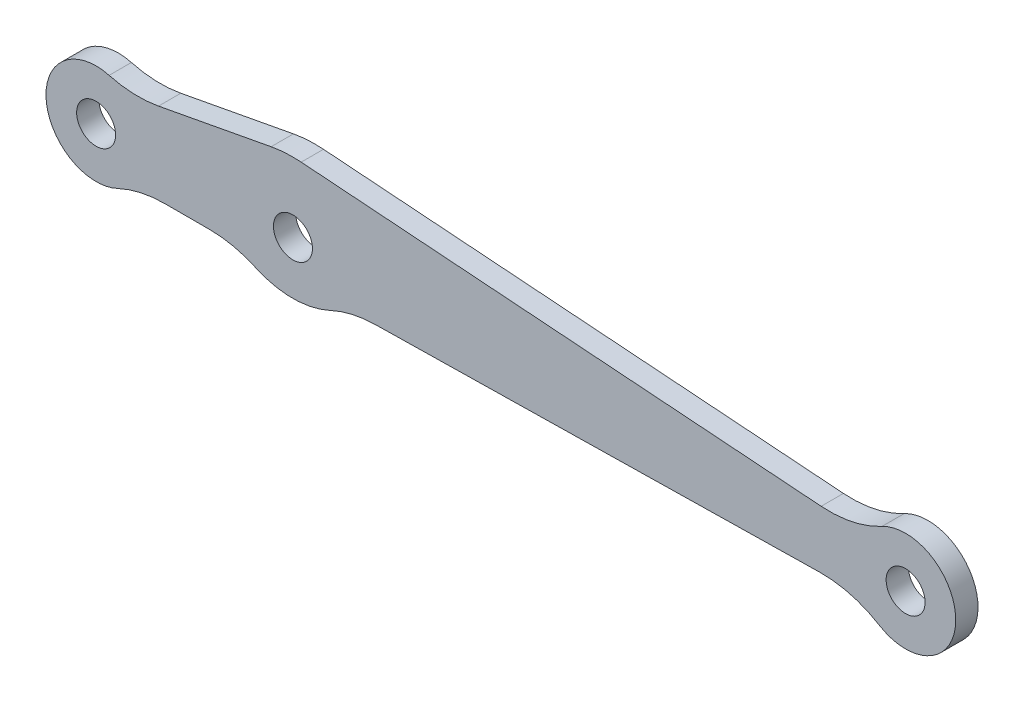
ISO-10303-21;
HEADER;
FILE_DESCRIPTION(('STEP AP214'),'2;1');
FILE_NAME('part.step','',(''),(''),'','','');
FILE_SCHEMA(('AUTOMOTIVE_DESIGN { 1 0 10303 214 1 1 1 1 }'));
ENDSEC;
DATA;
#1=APPLICATION_CONTEXT('core data for automotive mechanical design processes');
#2=APPLICATION_PROTOCOL_DEFINITION('international standard','automotive_design',2000,#1);
#3=PRODUCT_CONTEXT('',#1,'mechanical');
#4=PRODUCT('Part','Part','',(#3));
#5=PRODUCT_RELATED_PRODUCT_CATEGORY('part','',(#4));
#6=PRODUCT_DEFINITION_FORMATION('','',#4);
#7=PRODUCT_DEFINITION_CONTEXT('part definition',#1,'design');
#8=PRODUCT_DEFINITION('design','',#6,#7);
#9=PRODUCT_DEFINITION_SHAPE('','',#8);
#10=(LENGTH_UNIT() NAMED_UNIT(*) SI_UNIT(.MILLI.,.METRE.));
#11=(NAMED_UNIT(*) PLANE_ANGLE_UNIT() SI_UNIT($,.RADIAN.));
#12=(NAMED_UNIT(*) SI_UNIT($,.STERADIAN.) SOLID_ANGLE_UNIT());
#13=UNCERTAINTY_MEASURE_WITH_UNIT(LENGTH_MEASURE(1.E-05),#10,'distance_accuracy_value','');
#14=(GEOMETRIC_REPRESENTATION_CONTEXT(3) GLOBAL_UNCERTAINTY_ASSIGNED_CONTEXT((#13)) GLOBAL_UNIT_ASSIGNED_CONTEXT((#10,
#11,#12)) REPRESENTATION_CONTEXT('',''));
#15=CARTESIAN_POINT('',(0.,0.,0.));
#16=DIRECTION('',(0.,0.,1.));
#17=DIRECTION('',(1.,0.,0.));
#18=AXIS2_PLACEMENT_3D('',#15,#16,#17);
#19=CARTESIAN_POINT('',(48.1470908733665,12.7784050844424,2.));
#20=DIRECTION('',(0.,0.,-1.));
#21=DIRECTION('',(-1.,0.,0.));
#22=AXIS2_PLACEMENT_3D('',#19,#20,#21);
#23=PLANE('',#22);
#24=CARTESIAN_POINT('',(48.1470908733665,12.7784050844424,2.));
#25=DIRECTION('',(0.,0.,-1.));
#26=DIRECTION('',(-1.,0.,0.));
#27=AXIS2_PLACEMENT_3D('',#24,#25,#26);
#28=CIRCLE('',#27,9.99999999999999);
#29=CARTESIAN_POINT('',(52.873235098631,3.96571192275799,2.));
#30=VERTEX_POINT('',#29);
#31=CARTESIAN_POINT('',(47.4170222580364,2.8050906997,2.));
#32=VERTEX_POINT('',#31);
#33=EDGE_CURVE('E195',#30,#32,#28,.T.);
#34=ORIENTED_EDGE('',*,*,#33,.T.);
#35=DIRECTION('',(-0.997331438474241,0.0730068615330152,0.));
#36=VECTOR('',#35,1.);
#37=CARTESIAN_POINT('',(47.4170222580364,2.8050906997,2.));
#38=LINE('',#37,#36);
#39=CARTESIAN_POINT('',(0.741973806082332,6.22180721732193,2.));
#40=VERTEX_POINT('',#39);
#41=EDGE_CURVE('E113',#32,#40,#38,.T.);
#42=ORIENTED_EDGE('',*,*,#41,.T.);
#43=CARTESIAN_POINT('',(-0.0245982400143271,-4.2501728866576,2.));
#44=DIRECTION('',(0.,0.,1.));
#45=DIRECTION('',(-1.,0.,0.));
#46=AXIS2_PLACEMENT_3D('',#43,#44,#45);
#47=CIRCLE('',#46,10.5);
#48=CARTESIAN_POINT('',(-1.95917748938479,6.0700695101035,2.));
#49=VERTEX_POINT('',#48);
#50=EDGE_CURVE('E228',#40,#49,#47,.T.);
#51=ORIENTED_EDGE('',*,*,#50,.T.);
#52=DIRECTION('',(-0.982880228262961,-0.184245642797188,0.));
#53=VECTOR('',#52,1.);
#54=CARTESIAN_POINT('',(-1.95917748938479,6.0700695101035,2.));
#55=LINE('',#54,#53);
#56=CARTESIAN_POINT('',(-12.0675349542623,4.17520911390696,2.));
#57=VERTEX_POINT('',#56);
#58=EDGE_CURVE('E247',#49,#57,#55,.T.);
#59=ORIENTED_EDGE('',*,*,#58,.T.);
#60=CARTESIAN_POINT('',(-13.9099913822341,14.0040113965366,2.));
#61=DIRECTION('',(0.,0.,-1.));
#62=DIRECTION('',(-1.,0.,0.));
#63=AXIS2_PLACEMENT_3D('',#60,#61,#62);
#64=CIRCLE('',#63,10.);
#65=CARTESIAN_POINT('',(-16.5031007737968,4.34607250237342,2.));
#66=VERTEX_POINT('',#65);
#67=EDGE_CURVE('E244',#57,#66,#64,.T.);
#68=ORIENTED_EDGE('',*,*,#67,.T.);
#69=CARTESIAN_POINT('',(-17.67,0.,2.));
#70=DIRECTION('',(0.,0.,1.));
#71=DIRECTION('',(1.,0.,0.));
#72=AXIS2_PLACEMENT_3D('',#69,#70,#71);
#73=CIRCLE('',#72,4.5);
#74=CARTESIAN_POINT('',(-15.7572993565416,-4.07327586206896,2.));
#75=VERTEX_POINT('',#74);
#76=EDGE_CURVE('E246',#66,#75,#73,.T.);
#77=ORIENTED_EDGE('',*,*,#76,.T.);
#78=CARTESIAN_POINT('',(-11.5068534821895,-13.125,2.));
#79=DIRECTION('',(0.,0.,-1.));
#80=DIRECTION('',(-1.,0.,0.));
#81=AXIS2_PLACEMENT_3D('',#78,#79,#80);
#82=CIRCLE('',#81,9.99999999999999);
#83=CARTESIAN_POINT('',(-11.5068534821895,-3.125,2.));
#84=VERTEX_POINT('',#83);
#85=EDGE_CURVE('E249',#75,#84,#82,.T.);
#86=ORIENTED_EDGE('',*,*,#85,.T.);
#87=DIRECTION('',(1.,0.,0.));
#88=VECTOR('',#87,1.);
#89=CARTESIAN_POINT('',(-7.49859405959702,-3.125,2.));
#90=LINE('',#89,#88);
#91=CARTESIAN_POINT('',(-7.49859405959702,-3.12499999999998,2.));
#92=VERTEX_POINT('',#91);
#93=EDGE_CURVE('E255',#84,#92,#90,.T.);
#94=ORIENTED_EDGE('',*,*,#93,.T.);
#95=CARTESIAN_POINT('',(-7.49859405959702,-13.125,2.));
#96=DIRECTION('',(0.,0.,-1.));
#97=DIRECTION('',(1.,0.,0.));
#98=AXIS2_PLACEMENT_3D('',#95,#96,#97);
#99=CIRCLE('',#98,10.);
#100=CARTESIAN_POINT('',(-3.34637415982887,-4.02779878732091,2.));
#101=VERTEX_POINT('',#100);
#102=EDGE_CURVE('E257',#92,#101,#99,.T.);
#103=ORIENTED_EDGE('',*,*,#102,.T.);
#104=CARTESIAN_POINT('',(-0.0245982400143267,3.24996218282238,2.));
#105=DIRECTION('',(0.,0.,1.));
#106=DIRECTION('',(1.,0.,0.));
#107=AXIS2_PLACEMENT_3D('',#104,#105,#106);
#108=CIRCLE('',#107,8.00000000000004);
#109=CARTESIAN_POINT('',(3.3418696860677,-4.00723381168279,2.));
#110=VERTEX_POINT('',#109);
#111=EDGE_CURVE('E259',#101,#110,#108,.T.);
#112=ORIENTED_EDGE('',*,*,#111,.T.);
#113=CARTESIAN_POINT('',(7.5499545936702,-13.0787288048142,2.));
#114=DIRECTION('',(0.,0.,-1.));
#115=DIRECTION('',(-1.,0.,0.));
#116=AXIS2_PLACEMENT_3D('',#113,#114,#115);
#117=CIRCLE('',#116,10.);
#118=CARTESIAN_POINT('',(7.37564840586103,-3.08024805257532,2.));
#119=VERTEX_POINT('',#118);
#120=EDGE_CURVE('E150',#110,#119,#117,.T.);
#121=ORIENTED_EDGE('',*,*,#120,.T.);
#122=DIRECTION('',(0.999848075223888,0.0174306187809175,0.));
#123=VECTOR('',#122,1.);
#124=CARTESIAN_POINT('',(7.37564840586103,-3.08024805257532,2.));
#125=LINE('',#124,#123);
#126=CARTESIAN_POINT('',(47.2817916074741,-2.38455359018586,2.));
#127=VERTEX_POINT('',#126);
#128=EDGE_CURVE('E144',#119,#127,#125,.T.);
#129=ORIENTED_EDGE('',*,*,#128,.T.);
#130=CARTESIAN_POINT('',(47.4560977952833,-12.3830343424247,2.));
#131=DIRECTION('',(0.,0.,-1.));
#132=DIRECTION('',(1.,0.,0.));
#133=AXIS2_PLACEMENT_3D('',#130,#131,#132);
#134=CIRCLE('',#133,9.99999999999999);
#135=CARTESIAN_POINT('',(52.65878897095,-3.84301065799389,2.));
#136=VERTEX_POINT('',#135);
#137=EDGE_CURVE('E148',#127,#136,#134,.T.);
#138=ORIENTED_EDGE('',*,*,#137,.T.);
#139=CARTESIAN_POINT('',(55.,0.,2.));
#140=DIRECTION('',(0.,0.,1.));
#141=DIRECTION('',(-1.,0.,0.));
#142=AXIS2_PLACEMENT_3D('',#139,#140,#141);
#143=CIRCLE('',#142,4.5);
#144=EDGE_CURVE('E52',#136,#30,#143,.T.);
#145=ORIENTED_EDGE('',*,*,#144,.T.);
#146=EDGE_LOOP('',(#34,#42,#51,#59,#68,#77,#86,#94,#103,#112,#121,#129,#138,#145));
#147=FACE_BOUND('',#146,.T.);
#148=CARTESIAN_POINT('',(-17.67,0.,2.));
#149=DIRECTION('',(0.,0.,1.));
#150=DIRECTION('',(1.,0.,0.));
#151=AXIS2_PLACEMENT_3D('',#148,#149,#150);
#152=CIRCLE('',#151,1.75);
#153=CARTESIAN_POINT('',(-15.92,0.,2.));
#154=VERTEX_POINT('',#153);
#155=EDGE_CURVE('E172',#154,#154,#152,.T.);
#156=ORIENTED_EDGE('',*,*,#155,.F.);
#157=EDGE_LOOP('',(#156));
#158=FACE_BOUND('',#157,.T.);
#159=CARTESIAN_POINT('',(0.,0.,2.));
#160=DIRECTION('',(0.,0.,1.));
#161=DIRECTION('',(1.,0.,0.));
#162=AXIS2_PLACEMENT_3D('',#159,#160,#161);
#163=CIRCLE('',#162,1.75);
#164=CARTESIAN_POINT('',(1.75,0.,2.));
#165=VERTEX_POINT('',#164);
#166=EDGE_CURVE('E313',#165,#165,#163,.T.);
#167=ORIENTED_EDGE('',*,*,#166,.F.);
#168=EDGE_LOOP('',(#167));
#169=FACE_BOUND('',#168,.T.);
#170=CARTESIAN_POINT('',(55.,0.,2.));
#171=DIRECTION('',(0.,0.,1.));
#172=DIRECTION('',(1.,0.,0.));
#173=AXIS2_PLACEMENT_3D('',#170,#171,#172);
#174=CIRCLE('',#173,1.75);
#175=CARTESIAN_POINT('',(56.75,0.,2.));
#176=VERTEX_POINT('',#175);
#177=EDGE_CURVE('E304',#176,#176,#174,.T.);
#178=ORIENTED_EDGE('',*,*,#177,.F.);
#179=EDGE_LOOP('',(#178));
#180=FACE_BOUND('',#179,.T.);
#181=ADVANCED_FACE('F35',(#147,#158,#169,#180),#23,.F.);
#182=CARTESIAN_POINT('',(48.1470908733665,12.7784050844424,0.));
#183=DIRECTION('',(0.,0.,-1.));
#184=DIRECTION('',(-1.,0.,0.));
#185=AXIS2_PLACEMENT_3D('',#182,#183,#184);
#186=PLANE('',#185);
#187=CARTESIAN_POINT('',(0.,0.,0.));
#188=DIRECTION('',(0.,0.,1.));
#189=DIRECTION('',(1.,0.,0.));
#190=AXIS2_PLACEMENT_3D('',#187,#188,#189);
#191=CIRCLE('',#190,1.75);
#192=CARTESIAN_POINT('',(1.75,0.,0.));
#193=VERTEX_POINT('',#192);
#194=EDGE_CURVE('E310',#193,#193,#191,.T.);
#195=ORIENTED_EDGE('',*,*,#194,.T.);
#196=EDGE_LOOP('',(#195));
#197=FACE_BOUND('',#196,.T.);
#198=CARTESIAN_POINT('',(48.1470908733665,12.7784050844424,0.));
#199=DIRECTION('',(0.,0.,-1.));
#200=DIRECTION('',(-1.,0.,0.));
#201=AXIS2_PLACEMENT_3D('',#198,#199,#200);
#202=CIRCLE('',#201,9.99999999999999);
#203=CARTESIAN_POINT('',(52.873235098631,3.96571192275799,0.));
#204=VERTEX_POINT('',#203);
#205=CARTESIAN_POINT('',(47.4170222580364,2.8050906997,0.));
#206=VERTEX_POINT('',#205);
#207=EDGE_CURVE('E168',#204,#206,#202,.T.);
#208=ORIENTED_EDGE('',*,*,#207,.F.);
#209=CARTESIAN_POINT('',(55.,0.,0.));
#210=DIRECTION('',(0.,0.,1.));
#211=DIRECTION('',(-1.,0.,0.));
#212=AXIS2_PLACEMENT_3D('',#209,#210,#211);
#213=CIRCLE('',#212,4.5);
#214=CARTESIAN_POINT('',(52.65878897095,-3.84301065799389,0.));
#215=VERTEX_POINT('',#214);
#216=EDGE_CURVE('E105',#215,#204,#213,.T.);
#217=ORIENTED_EDGE('',*,*,#216,.F.);
#218=CARTESIAN_POINT('',(47.4560977952833,-12.3830343424247,0.));
#219=DIRECTION('',(0.,0.,-1.));
#220=DIRECTION('',(1.,0.,0.));
#221=AXIS2_PLACEMENT_3D('',#218,#219,#220);
#222=CIRCLE('',#221,9.99999999999999);
#223=CARTESIAN_POINT('',(47.2817916074741,-2.38455359018586,0.));
#224=VERTEX_POINT('',#223);
#225=EDGE_CURVE('E99',#224,#215,#222,.T.);
#226=ORIENTED_EDGE('',*,*,#225,.F.);
#227=DIRECTION('',(0.999848075223888,0.0174306187809175,0.));
#228=VECTOR('',#227,1.);
#229=CARTESIAN_POINT('',(7.37564840586103,-3.08024805257532,0.));
#230=LINE('',#229,#228);
#231=CARTESIAN_POINT('',(7.37564840586103,-3.08024805257532,0.));
#232=VERTEX_POINT('',#231);
#233=EDGE_CURVE('E158',#232,#224,#230,.T.);
#234=ORIENTED_EDGE('',*,*,#233,.F.);
#235=CARTESIAN_POINT('',(7.5499545936702,-13.0787288048142,0.));
#236=DIRECTION('',(0.,0.,-1.));
#237=DIRECTION('',(-1.,0.,0.));
#238=AXIS2_PLACEMENT_3D('',#235,#236,#237);
#239=CIRCLE('',#238,10.);
#240=CARTESIAN_POINT('',(3.3418696860677,-4.00723381168279,0.));
#241=VERTEX_POINT('',#240);
#242=EDGE_CURVE('E190',#241,#232,#239,.T.);
#243=ORIENTED_EDGE('',*,*,#242,.F.);
#244=CARTESIAN_POINT('',(-0.0245982400143267,3.24996218282238,0.));
#245=DIRECTION('',(0.,0.,1.));
#246=DIRECTION('',(1.,0.,0.));
#247=AXIS2_PLACEMENT_3D('',#244,#245,#246);
#248=CIRCLE('',#247,8.00000000000004);
#249=CARTESIAN_POINT('',(-3.34637415982887,-4.02779878732091,0.));
#250=VERTEX_POINT('',#249);
#251=EDGE_CURVE('E188',#250,#241,#248,.T.);
#252=ORIENTED_EDGE('',*,*,#251,.F.);
#253=CARTESIAN_POINT('',(-7.49859405959702,-13.125,0.));
#254=DIRECTION('',(0.,0.,-1.));
#255=DIRECTION('',(1.,0.,0.));
#256=AXIS2_PLACEMENT_3D('',#253,#254,#255);
#257=CIRCLE('',#256,10.);
#258=CARTESIAN_POINT('',(-7.49859405959702,-3.12499999999998,0.));
#259=VERTEX_POINT('',#258);
#260=EDGE_CURVE('E186',#259,#250,#257,.T.);
#261=ORIENTED_EDGE('',*,*,#260,.F.);
#262=DIRECTION('',(1.,0.,0.));
#263=VECTOR('',#262,1.);
#264=CARTESIAN_POINT('',(-7.49859405959702,-3.125,0.));
#265=LINE('',#264,#263);
#266=CARTESIAN_POINT('',(-11.5068534821895,-3.125,0.));
#267=VERTEX_POINT('',#266);
#268=EDGE_CURVE('E184',#267,#259,#265,.T.);
#269=ORIENTED_EDGE('',*,*,#268,.F.);
#270=CARTESIAN_POINT('',(-11.5068534821895,-13.125,0.));
#271=DIRECTION('',(0.,0.,-1.));
#272=DIRECTION('',(-1.,0.,0.));
#273=AXIS2_PLACEMENT_3D('',#270,#271,#272);
#274=CIRCLE('',#273,9.99999999999999);
#275=CARTESIAN_POINT('',(-15.7572993565416,-4.07327586206896,0.));
#276=VERTEX_POINT('',#275);
#277=EDGE_CURVE('E182',#276,#267,#274,.T.);
#278=ORIENTED_EDGE('',*,*,#277,.F.);
#279=CARTESIAN_POINT('',(-17.67,0.,0.));
#280=DIRECTION('',(0.,0.,1.));
#281=DIRECTION('',(1.,0.,0.));
#282=AXIS2_PLACEMENT_3D('',#279,#280,#281);
#283=CIRCLE('',#282,4.5);
#284=CARTESIAN_POINT('',(-16.5031007737968,4.34607250237342,0.));
#285=VERTEX_POINT('',#284);
#286=EDGE_CURVE('E180',#285,#276,#283,.T.);
#287=ORIENTED_EDGE('',*,*,#286,.F.);
#288=CARTESIAN_POINT('',(-13.9099913822341,14.0040113965366,0.));
#289=DIRECTION('',(0.,0.,-1.));
#290=DIRECTION('',(-1.,0.,0.));
#291=AXIS2_PLACEMENT_3D('',#288,#289,#290);
#292=CIRCLE('',#291,10.);
#293=CARTESIAN_POINT('',(-12.0675349542623,4.17520911390696,0.));
#294=VERTEX_POINT('',#293);
#295=EDGE_CURVE('E178',#294,#285,#292,.T.);
#296=ORIENTED_EDGE('',*,*,#295,.F.);
#297=DIRECTION('',(-0.982880228262961,-0.184245642797188,0.));
#298=VECTOR('',#297,1.);
#299=CARTESIAN_POINT('',(-1.95917748938479,6.0700695101035,0.));
#300=LINE('',#299,#298);
#301=CARTESIAN_POINT('',(-1.95917748938479,6.0700695101035,0.));
#302=VERTEX_POINT('',#301);
#303=EDGE_CURVE('E176',#302,#294,#300,.T.);
#304=ORIENTED_EDGE('',*,*,#303,.F.);
#305=CARTESIAN_POINT('',(-0.0245982400143271,-4.2501728866576,0.));
#306=DIRECTION('',(0.,0.,1.));
#307=DIRECTION('',(-1.,0.,0.));
#308=AXIS2_PLACEMENT_3D('',#305,#306,#307);
#309=CIRCLE('',#308,10.5);
#310=CARTESIAN_POINT('',(0.741973806082332,6.22180721732193,0.));
#311=VERTEX_POINT('',#310);
#312=EDGE_CURVE('E174',#311,#302,#309,.T.);
#313=ORIENTED_EDGE('',*,*,#312,.F.);
#314=DIRECTION('',(-0.997331438474241,0.0730068615330152,0.));
#315=VECTOR('',#314,1.);
#316=CARTESIAN_POINT('',(47.4170222580364,2.8050906997,0.));
#317=LINE('',#316,#315);
#318=EDGE_CURVE('E171',#206,#311,#317,.T.);
#319=ORIENTED_EDGE('',*,*,#318,.F.);
#320=EDGE_LOOP('',(#208,#217,#226,#234,#243,#252,#261,#269,#278,#287,#296,#304,#313,#319));
#321=FACE_BOUND('',#320,.T.);
#322=CARTESIAN_POINT('',(-17.67,0.,0.));
#323=DIRECTION('',(0.,0.,1.));
#324=DIRECTION('',(1.,0.,0.));
#325=AXIS2_PLACEMENT_3D('',#322,#323,#324);
#326=CIRCLE('',#325,1.75);
#327=CARTESIAN_POINT('',(-15.92,0.,0.));
#328=VERTEX_POINT('',#327);
#329=EDGE_CURVE('E316',#328,#328,#326,.T.);
#330=ORIENTED_EDGE('',*,*,#329,.T.);
#331=EDGE_LOOP('',(#330));
#332=FACE_BOUND('',#331,.T.);
#333=CARTESIAN_POINT('',(55.,0.,0.));
#334=DIRECTION('',(0.,0.,1.));
#335=DIRECTION('',(1.,0.,0.));
#336=AXIS2_PLACEMENT_3D('',#333,#334,#335);
#337=CIRCLE('',#336,1.75);
#338=CARTESIAN_POINT('',(56.75,0.,0.));
#339=VERTEX_POINT('',#338);
#340=EDGE_CURVE('E307',#339,#339,#337,.T.);
#341=ORIENTED_EDGE('',*,*,#340,.T.);
#342=EDGE_LOOP('',(#341));
#343=FACE_BOUND('',#342,.T.);
#344=ADVANCED_FACE('F232',(#197,#321,#332,#343),#186,.T.);
#345=CARTESIAN_POINT('',(48.1470908733665,12.7784050844424,2.));
#346=DIRECTION('',(0.,0.,-1.));
#347=DIRECTION('',(-1.,0.,0.));
#348=AXIS2_PLACEMENT_3D('',#345,#346,#347);
#349=CYLINDRICAL_SURFACE('',#348,9.99999999999999);
#350=ORIENTED_EDGE('',*,*,#207,.T.);
#351=DIRECTION('',(0.,0.,-1.));
#352=VECTOR('',#351,1.);
#353=CARTESIAN_POINT('',(47.4170222580364,2.8050906997,2.));
#354=LINE('',#353,#352);
#355=EDGE_CURVE('E11',#32,#206,#354,.T.);
#356=ORIENTED_EDGE('',*,*,#355,.F.);
#357=ORIENTED_EDGE('',*,*,#33,.F.);
#358=DIRECTION('',(0.,0.,-1.));
#359=VECTOR('',#358,1.);
#360=CARTESIAN_POINT('',(52.873235098631,3.96571192275799,2.));
#361=LINE('',#360,#359);
#362=EDGE_CURVE('E164',#30,#204,#361,.T.);
#363=ORIENTED_EDGE('',*,*,#362,.T.);
#364=EDGE_LOOP('',(#350,#356,#357,#363));
#365=FACE_BOUND('',#364,.T.);
#366=ADVANCED_FACE('F37',(#365),#349,.F.);
#367=CARTESIAN_POINT('',(47.4170222580364,2.8050906997,2.));
#368=DIRECTION('',(-0.0730068615330152,-0.997331438474241,0.));
#369=DIRECTION('',(0.997331438474241,-0.0730068615330152,0.));
#370=AXIS2_PLACEMENT_3D('',#367,#368,#369);
#371=PLANE('',#370);
#372=ORIENTED_EDGE('',*,*,#318,.T.);
#373=DIRECTION('',(0.,0.,-1.));
#374=VECTOR('',#373,1.);
#375=CARTESIAN_POINT('',(0.741973806082332,6.22180721732193,2.));
#376=LINE('',#375,#374);
#377=EDGE_CURVE('E44',#40,#311,#376,.T.);
#378=ORIENTED_EDGE('',*,*,#377,.F.);
#379=ORIENTED_EDGE('',*,*,#41,.F.);
#380=ORIENTED_EDGE('',*,*,#355,.T.);
#381=EDGE_LOOP('',(#372,#378,#379,#380));
#382=FACE_BOUND('',#381,.T.);
#383=ADVANCED_FACE('F415',(#382),#371,.F.);
#384=CARTESIAN_POINT('',(-0.0245982400143271,-4.2501728866576,2.));
#385=DIRECTION('',(0.,0.,-1.));
#386=DIRECTION('',(-1.,0.,0.));
#387=AXIS2_PLACEMENT_3D('',#384,#385,#386);
#388=CYLINDRICAL_SURFACE('',#387,10.5);
#389=ORIENTED_EDGE('',*,*,#312,.T.);
#390=DIRECTION('',(0.,0.,-1.));
#391=VECTOR('',#390,1.);
#392=CARTESIAN_POINT('',(-1.95917748938479,6.0700695101035,2.));
#393=LINE('',#392,#391);
#394=EDGE_CURVE('E220',#49,#302,#393,.T.);
#395=ORIENTED_EDGE('',*,*,#394,.F.);
#396=ORIENTED_EDGE('',*,*,#50,.F.);
#397=ORIENTED_EDGE('',*,*,#377,.T.);
#398=EDGE_LOOP('',(#389,#395,#396,#397));
#399=FACE_BOUND('',#398,.T.);
#400=ADVANCED_FACE('F226',(#399),#388,.T.);
#401=CARTESIAN_POINT('',(-1.95917748938479,6.0700695101035,2.));
#402=DIRECTION('',(0.184245642797188,-0.982880228262962,0.));
#403=DIRECTION('',(0.982880228262962,0.184245642797188,0.));
#404=AXIS2_PLACEMENT_3D('',#401,#402,#403);
#405=PLANE('',#404);
#406=ORIENTED_EDGE('',*,*,#303,.T.);
#407=DIRECTION('',(0.,0.,-1.));
#408=VECTOR('',#407,1.);
#409=CARTESIAN_POINT('',(-12.0675349542623,4.17520911390696,2.));
#410=LINE('',#409,#408);
#411=EDGE_CURVE('E217',#57,#294,#410,.T.);
#412=ORIENTED_EDGE('',*,*,#411,.F.);
#413=ORIENTED_EDGE('',*,*,#58,.F.);
#414=ORIENTED_EDGE('',*,*,#394,.T.);
#415=EDGE_LOOP('',(#406,#412,#413,#414));
#416=FACE_BOUND('',#415,.T.);
#417=ADVANCED_FACE('F238',(#416),#405,.F.);
#418=CARTESIAN_POINT('',(-13.9099913822341,14.0040113965366,2.));
#419=DIRECTION('',(0.,0.,-1.));
#420=DIRECTION('',(-1.,0.,0.));
#421=AXIS2_PLACEMENT_3D('',#418,#419,#420);
#422=CYLINDRICAL_SURFACE('',#421,10.);
#423=ORIENTED_EDGE('',*,*,#295,.T.);
#424=DIRECTION('',(0.,0.,-1.));
#425=VECTOR('',#424,1.);
#426=CARTESIAN_POINT('',(-16.5031007737968,4.34607250237342,2.));
#427=LINE('',#426,#425);
#428=EDGE_CURVE('E214',#66,#285,#427,.T.);
#429=ORIENTED_EDGE('',*,*,#428,.F.);
#430=ORIENTED_EDGE('',*,*,#67,.F.);
#431=ORIENTED_EDGE('',*,*,#411,.T.);
#432=EDGE_LOOP('',(#423,#429,#430,#431));
#433=FACE_BOUND('',#432,.T.);
#434=ADVANCED_FACE('F242',(#433),#422,.F.);
#435=CARTESIAN_POINT('',(-17.67,0.,2.));
#436=DIRECTION('',(0.,0.,-1.));
#437=DIRECTION('',(-1.,0.,0.));
#438=AXIS2_PLACEMENT_3D('',#435,#436,#437);
#439=CYLINDRICAL_SURFACE('',#438,4.5);
#440=ORIENTED_EDGE('',*,*,#286,.T.);
#441=DIRECTION('',(0.,0.,-1.));
#442=VECTOR('',#441,1.);
#443=CARTESIAN_POINT('',(-15.7572993565416,-4.07327586206896,2.));
#444=LINE('',#443,#442);
#445=EDGE_CURVE('E211',#75,#276,#444,.T.);
#446=ORIENTED_EDGE('',*,*,#445,.F.);
#447=ORIENTED_EDGE('',*,*,#76,.F.);
#448=ORIENTED_EDGE('',*,*,#428,.T.);
#449=EDGE_LOOP('',(#440,#446,#447,#448));
#450=FACE_BOUND('',#449,.T.);
#451=ADVANCED_FACE('F388',(#450),#439,.T.);
#452=CARTESIAN_POINT('',(-11.5068534821895,-13.125,2.));
#453=DIRECTION('',(0.,0.,-1.));
#454=DIRECTION('',(-1.,0.,0.));
#455=AXIS2_PLACEMENT_3D('',#452,#453,#454);
#456=CYLINDRICAL_SURFACE('',#455,9.99999999999999);
#457=ORIENTED_EDGE('',*,*,#277,.T.);
#458=DIRECTION('',(0.,0.,-1.));
#459=VECTOR('',#458,1.);
#460=CARTESIAN_POINT('',(-11.5068534821895,-3.125,2.));
#461=LINE('',#460,#459);
#462=EDGE_CURVE('E208',#84,#267,#461,.T.);
#463=ORIENTED_EDGE('',*,*,#462,.F.);
#464=ORIENTED_EDGE('',*,*,#85,.F.);
#465=ORIENTED_EDGE('',*,*,#445,.T.);
#466=EDGE_LOOP('',(#457,#463,#464,#465));
#467=FACE_BOUND('',#466,.T.);
#468=ADVANCED_FACE('F380',(#467),#456,.F.);
#469=CARTESIAN_POINT('',(-7.49859405959702,-3.125,2.));
#470=DIRECTION('',(0.,1.,0.));
#471=DIRECTION('',(0.,0.,1.));
#472=AXIS2_PLACEMENT_3D('',#469,#470,#471);
#473=PLANE('',#472);
#474=ORIENTED_EDGE('',*,*,#268,.T.);
#475=DIRECTION('',(0.,0.,-1.));
#476=VECTOR('',#475,1.);
#477=CARTESIAN_POINT('',(-7.49859405959702,-3.12499999999998,2.));
#478=LINE('',#477,#476);
#479=EDGE_CURVE('E205',#92,#259,#478,.T.);
#480=ORIENTED_EDGE('',*,*,#479,.F.);
#481=ORIENTED_EDGE('',*,*,#93,.F.);
#482=ORIENTED_EDGE('',*,*,#462,.T.);
#483=EDGE_LOOP('',(#474,#480,#481,#482));
#484=FACE_BOUND('',#483,.T.);
#485=ADVANCED_FACE('F372',(#484),#473,.F.);
#486=CARTESIAN_POINT('',(-7.49859405959702,-13.125,2.));
#487=DIRECTION('',(0.,0.,-1.));
#488=DIRECTION('',(-1.,0.,0.));
#489=AXIS2_PLACEMENT_3D('',#486,#487,#488);
#490=CYLINDRICAL_SURFACE('',#489,10.);
#491=ORIENTED_EDGE('',*,*,#260,.T.);
#492=DIRECTION('',(0.,0.,-1.));
#493=VECTOR('',#492,1.);
#494=CARTESIAN_POINT('',(-3.34637415982887,-4.02779878732091,2.));
#495=LINE('',#494,#493);
#496=EDGE_CURVE('E202',#101,#250,#495,.T.);
#497=ORIENTED_EDGE('',*,*,#496,.F.);
#498=ORIENTED_EDGE('',*,*,#102,.F.);
#499=ORIENTED_EDGE('',*,*,#479,.T.);
#500=EDGE_LOOP('',(#491,#497,#498,#499));
#501=FACE_BOUND('',#500,.T.);
#502=ADVANCED_FACE('F365',(#501),#490,.F.);
#503=CARTESIAN_POINT('',(-0.0245982400143267,3.24996218282238,2.));
#504=DIRECTION('',(0.,0.,-1.));
#505=DIRECTION('',(-1.,0.,0.));
#506=AXIS2_PLACEMENT_3D('',#503,#504,#505);
#507=CYLINDRICAL_SURFACE('',#506,8.00000000000004);
#508=ORIENTED_EDGE('',*,*,#251,.T.);
#509=DIRECTION('',(0.,0.,-1.));
#510=VECTOR('',#509,1.);
#511=CARTESIAN_POINT('',(3.3418696860677,-4.00723381168279,2.));
#512=LINE('',#511,#510);
#513=EDGE_CURVE('E199',#110,#241,#512,.T.);
#514=ORIENTED_EDGE('',*,*,#513,.F.);
#515=ORIENTED_EDGE('',*,*,#111,.F.);
#516=ORIENTED_EDGE('',*,*,#496,.T.);
#517=EDGE_LOOP('',(#508,#514,#515,#516));
#518=FACE_BOUND('',#517,.T.);
#519=ADVANCED_FACE('F265',(#518),#507,.T.);
#520=CARTESIAN_POINT('',(7.5499545936702,-13.0787288048142,2.));
#521=DIRECTION('',(0.,0.,-1.));
#522=DIRECTION('',(-1.,0.,0.));
#523=AXIS2_PLACEMENT_3D('',#520,#521,#522);
#524=CYLINDRICAL_SURFACE('',#523,10.);
#525=ORIENTED_EDGE('',*,*,#242,.T.);
#526=DIRECTION('',(0.,0.,-1.));
#527=VECTOR('',#526,1.);
#528=CARTESIAN_POINT('',(7.37564840586103,-3.08024805257532,2.));
#529=LINE('',#528,#527);
#530=EDGE_CURVE('E159',#119,#232,#529,.T.);
#531=ORIENTED_EDGE('',*,*,#530,.F.);
#532=ORIENTED_EDGE('',*,*,#120,.F.);
#533=ORIENTED_EDGE('',*,*,#513,.T.);
#534=EDGE_LOOP('',(#525,#531,#532,#533));
#535=FACE_BOUND('',#534,.T.);
#536=ADVANCED_FACE('F269',(#535),#524,.F.);
#537=CARTESIAN_POINT('',(7.37564840586103,-3.08024805257532,2.));
#538=DIRECTION('',(-0.0174306187809175,0.999848075223888,0.));
#539=DIRECTION('',(-0.999848075223889,-0.0174306187809175,0.));
#540=AXIS2_PLACEMENT_3D('',#537,#538,#539);
#541=PLANE('',#540);
#542=ORIENTED_EDGE('',*,*,#233,.T.);
#543=DIRECTION('',(0.,0.,-1.));
#544=VECTOR('',#543,1.);
#545=CARTESIAN_POINT('',(47.2817916074741,-2.38455359018586,2.));
#546=LINE('',#545,#544);
#547=EDGE_CURVE('E155',#127,#224,#546,.T.);
#548=ORIENTED_EDGE('',*,*,#547,.F.);
#549=ORIENTED_EDGE('',*,*,#128,.F.);
#550=ORIENTED_EDGE('',*,*,#530,.T.);
#551=EDGE_LOOP('',(#542,#548,#549,#550));
#552=FACE_BOUND('',#551,.T.);
#553=ADVANCED_FACE('F156',(#552),#541,.F.);
#554=CARTESIAN_POINT('',(47.4560977952833,-12.3830343424247,2.));
#555=DIRECTION('',(0.,0.,-1.));
#556=DIRECTION('',(-1.,0.,0.));
#557=AXIS2_PLACEMENT_3D('',#554,#555,#556);
#558=CYLINDRICAL_SURFACE('',#557,9.99999999999999);
#559=ORIENTED_EDGE('',*,*,#225,.T.);
#560=DIRECTION('',(0.,0.,-1.));
#561=VECTOR('',#560,1.);
#562=CARTESIAN_POINT('',(52.65878897095,-3.84301065799389,2.));
#563=LINE('',#562,#561);
#564=EDGE_CURVE('E160',#136,#215,#563,.T.);
#565=ORIENTED_EDGE('',*,*,#564,.F.);
#566=ORIENTED_EDGE('',*,*,#137,.F.);
#567=ORIENTED_EDGE('',*,*,#547,.T.);
#568=EDGE_LOOP('',(#559,#565,#566,#567));
#569=FACE_BOUND('',#568,.T.);
#570=ADVANCED_FACE('F162',(#569),#558,.F.);
#571=CARTESIAN_POINT('',(55.,0.,2.));
#572=DIRECTION('',(0.,0.,-1.));
#573=DIRECTION('',(-1.,0.,0.));
#574=AXIS2_PLACEMENT_3D('',#571,#572,#573);
#575=CYLINDRICAL_SURFACE('',#574,4.5);
#576=ORIENTED_EDGE('',*,*,#216,.T.);
#577=ORIENTED_EDGE('',*,*,#362,.F.);
#578=ORIENTED_EDGE('',*,*,#144,.F.);
#579=ORIENTED_EDGE('',*,*,#564,.T.);
#580=EDGE_LOOP('',(#576,#577,#578,#579));
#581=FACE_BOUND('',#580,.T.);
#582=ADVANCED_FACE('F273',(#581),#575,.T.);
#583=CARTESIAN_POINT('',(-17.67,0.,2.));
#584=DIRECTION('',(0.,0.,-1.));
#585=DIRECTION('',(-1.,0.,0.));
#586=AXIS2_PLACEMENT_3D('',#583,#584,#585);
#587=CYLINDRICAL_SURFACE('',#586,1.75);
#588=ORIENTED_EDGE('',*,*,#155,.T.);
#589=EDGE_LOOP('',(#588));
#590=FACE_BOUND('',#589,.T.);
#591=ORIENTED_EDGE('',*,*,#329,.F.);
#592=EDGE_LOOP('',(#591));
#593=FACE_BOUND('',#592,.T.);
#594=ADVANCED_FACE('F275',(#590,#593),#587,.F.);
#595=CARTESIAN_POINT('',(0.,0.,2.));
#596=DIRECTION('',(0.,0.,-1.));
#597=DIRECTION('',(-1.,0.,0.));
#598=AXIS2_PLACEMENT_3D('',#595,#596,#597);
#599=CYLINDRICAL_SURFACE('',#598,1.75);
#600=ORIENTED_EDGE('',*,*,#166,.T.);
#601=EDGE_LOOP('',(#600));
#602=FACE_BOUND('',#601,.T.);
#603=ORIENTED_EDGE('',*,*,#194,.F.);
#604=EDGE_LOOP('',(#603));
#605=FACE_BOUND('',#604,.T.);
#606=ADVANCED_FACE('F281',(#602,#605),#599,.F.);
#607=CARTESIAN_POINT('',(55.,0.,2.));
#608=DIRECTION('',(0.,0.,-1.));
#609=DIRECTION('',(-1.,0.,0.));
#610=AXIS2_PLACEMENT_3D('',#607,#608,#609);
#611=CYLINDRICAL_SURFACE('',#610,1.75);
#612=ORIENTED_EDGE('',*,*,#177,.T.);
#613=EDGE_LOOP('',(#612));
#614=FACE_BOUND('',#613,.T.);
#615=ORIENTED_EDGE('',*,*,#340,.F.);
#616=EDGE_LOOP('',(#615));
#617=FACE_BOUND('',#616,.T.);
#618=ADVANCED_FACE('F295',(#614,#617),#611,.F.);
#619=CLOSED_SHELL('',(#181,#344,#366,#383,#400,#417,#434,#451,#468,#485,#502,#519,#536,#553,
#570,#582,#594,#606,#618));
#620=MANIFOLD_SOLID_BREP('B2',#619);
#621=ADVANCED_BREP_SHAPE_REPRESENTATION('',(#18,#620),#14);
#622=SHAPE_DEFINITION_REPRESENTATION(#9,#621);
ENDSEC;
END-ISO-10303-21;
